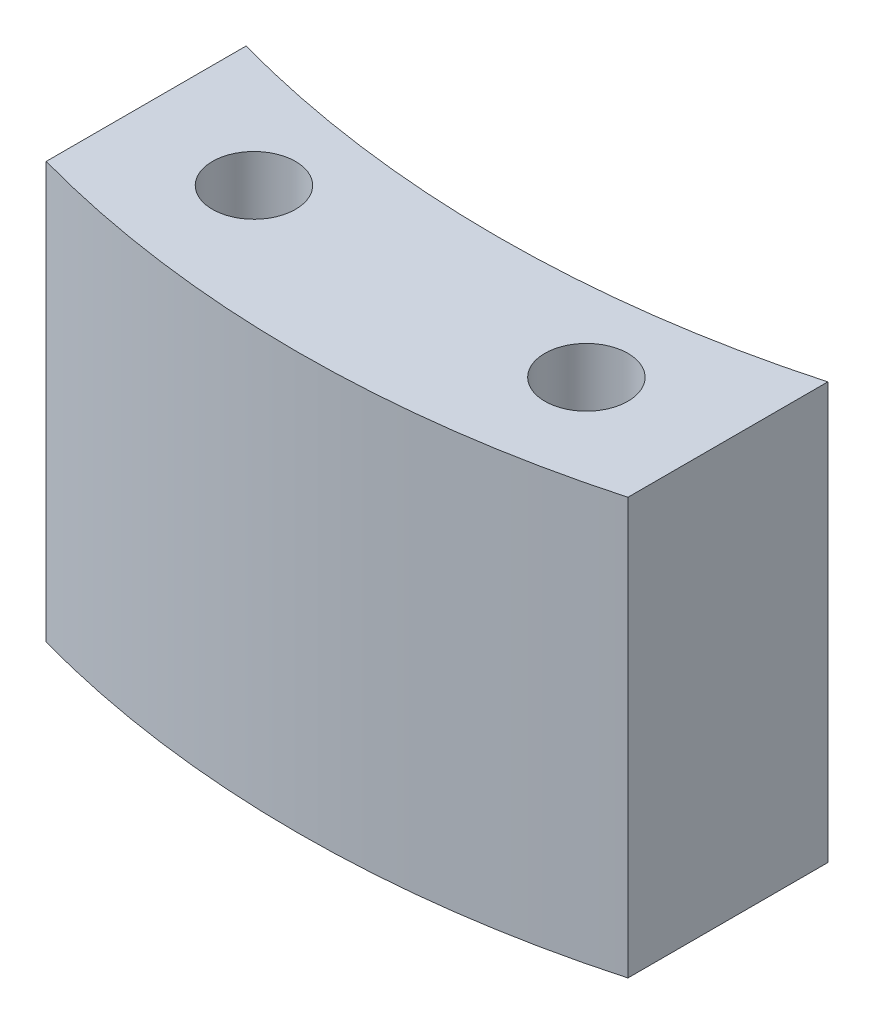
ISO-10303-21;
HEADER;
FILE_DESCRIPTION(('STEP AP214'),'2;1');
FILE_NAME('part.step','',(''),(''),'','','');
FILE_SCHEMA(('AUTOMOTIVE_DESIGN { 1 0 10303 214 1 1 1 1 }'));
ENDSEC;
DATA;
#1=APPLICATION_CONTEXT('core data for automotive mechanical design processes');
#2=APPLICATION_PROTOCOL_DEFINITION('international standard','automotive_design',2000,#1);
#3=PRODUCT_CONTEXT('',#1,'mechanical');
#4=PRODUCT('Part','Part','',(#3));
#5=PRODUCT_RELATED_PRODUCT_CATEGORY('part','',(#4));
#6=PRODUCT_DEFINITION_FORMATION('','',#4);
#7=PRODUCT_DEFINITION_CONTEXT('part definition',#1,'design');
#8=PRODUCT_DEFINITION('design','',#6,#7);
#9=PRODUCT_DEFINITION_SHAPE('','',#8);
#10=(LENGTH_UNIT() NAMED_UNIT(*) SI_UNIT(.MILLI.,.METRE.));
#11=(NAMED_UNIT(*) PLANE_ANGLE_UNIT() SI_UNIT($,.RADIAN.));
#12=(NAMED_UNIT(*) SI_UNIT($,.STERADIAN.) SOLID_ANGLE_UNIT());
#13=UNCERTAINTY_MEASURE_WITH_UNIT(LENGTH_MEASURE(1.E-05),#10,'distance_accuracy_value','');
#14=(GEOMETRIC_REPRESENTATION_CONTEXT(3) GLOBAL_UNCERTAINTY_ASSIGNED_CONTEXT((#13)) GLOBAL_UNIT_ASSIGNED_CONTEXT((#10,
#11,#12)) REPRESENTATION_CONTEXT('',''));
#15=CARTESIAN_POINT('',(0.,0.,0.));
#16=DIRECTION('',(0.,0.,1.));
#17=DIRECTION('',(1.,0.,0.));
#18=AXIS2_PLACEMENT_3D('',#15,#16,#17);
#19=CARTESIAN_POINT('',(0.,10.3886,0.));
#20=DIRECTION('',(0.,1.,0.));
#21=DIRECTION('',(0.,0.,1.));
#22=AXIS2_PLACEMENT_3D('',#19,#20,#21);
#23=PLANE('',#22);
#24=DIRECTION('',(0.745439659060937,0.,0.666573112793423));
#25=VECTOR('',#24,1.);
#26=CARTESIAN_POINT('',(5.58210296924748,10.3886,-6.24255742449733));
#27=LINE('',#26,#25);
#28=CARTESIAN_POINT('',(22.225,10.3886,8.63954274933077));
#29=VERTEX_POINT('',#28);
#30=CARTESIAN_POINT('',(5.58210296924748,10.3886,-6.24255742449733));
#31=VERTEX_POINT('',#30);
#32=EDGE_CURVE('E92',#29,#31,#27,.F.);
#33=ORIENTED_EDGE('',*,*,#32,.T.);
#34=CARTESIAN_POINT('',(0.,10.3886,0.));
#35=DIRECTION('',(0.,-1.,0.));
#36=DIRECTION('',(0.,0.,-1.));
#37=AXIS2_PLACEMENT_3D('',#34,#35,#36);
#38=CIRCLE('',#37,8.37432963033032);
#39=CARTESIAN_POINT('',(-5.58210296924748,10.3886,-6.24255742449734));
#40=VERTEX_POINT('',#39);
#41=EDGE_CURVE('E78',#40,#31,#38,.T.);
#42=ORIENTED_EDGE('',*,*,#41,.F.);
#43=DIRECTION('',(-0.745439659060937,0.,0.666573112793423));
#44=VECTOR('',#43,1.);
#45=CARTESIAN_POINT('',(-5.58210296924748,10.3886,-6.24255742449733));
#46=LINE('',#45,#44);
#47=CARTESIAN_POINT('',(-22.225,10.3886,8.63954274933077));
#48=VERTEX_POINT('',#47);
#49=EDGE_CURVE('E100',#48,#40,#46,.F.);
#50=ORIENTED_EDGE('',*,*,#49,.F.);
#51=CARTESIAN_POINT('',(0.,10.3886,-71.8463443264393));
#52=DIRECTION('',(0.,1.,0.));
#53=DIRECTION('',(0.,0.,1.));
#54=AXIS2_PLACEMENT_3D('',#51,#52,#53);
#55=CIRCLE('',#54,83.4980756866505);
#56=EDGE_CURVE('E95',#48,#29,#55,.T.);
#57=ORIENTED_EDGE('',*,*,#56,.T.);
#58=EDGE_LOOP('',(#33,#42,#50,#57));
#59=FACE_BOUND('',#58,.T.);
#60=CARTESIAN_POINT('',(0.,10.3886,0.));
#61=DIRECTION('',(0.,1.,0.));
#62=DIRECTION('',(0.,0.,1.));
#63=AXIS2_PLACEMENT_3D('',#60,#61,#62);
#64=CIRCLE('',#63,4.7498);
#65=CARTESIAN_POINT('',(0.,10.3886,4.7498));
#66=VERTEX_POINT('',#65);
#67=EDGE_CURVE('E19',#66,#66,#64,.F.);
#68=ORIENTED_EDGE('',*,*,#67,.T.);
#69=EDGE_LOOP('',(#68));
#70=FACE_BOUND('',#69,.T.);
#71=ADVANCED_FACE('F16',(#59,#70),#23,.T.);
#72=CARTESIAN_POINT('',(0.,0.,0.));
#73=DIRECTION('',(0.,1.,0.));
#74=DIRECTION('',(0.,0.,1.));
#75=AXIS2_PLACEMENT_3D('',#72,#73,#74);
#76=CYLINDRICAL_SURFACE('',#75,4.7498);
#77=CARTESIAN_POINT('',(0.,0.,0.));
#78=DIRECTION('',(0.,1.,0.));
#79=DIRECTION('',(0.,0.,1.));
#80=AXIS2_PLACEMENT_3D('',#77,#78,#79);
#81=CIRCLE('',#80,4.7498);
#82=CARTESIAN_POINT('',(0.,0.,4.7498));
#83=VERTEX_POINT('',#82);
#84=EDGE_CURVE('E142',#83,#83,#81,.F.);
#85=ORIENTED_EDGE('',*,*,#84,.T.);
#86=EDGE_LOOP('',(#85));
#87=FACE_BOUND('',#86,.T.);
#88=ORIENTED_EDGE('',*,*,#67,.F.);
#89=EDGE_LOOP('',(#88));
#90=FACE_BOUND('',#89,.T.);
#91=ADVANCED_FACE('F261',(#87,#90),#76,.F.);
#92=CARTESIAN_POINT('',(0.,31.8135,0.));
#93=DIRECTION('',(0.,-1.,0.));
#94=DIRECTION('',(0.,0.,-1.));
#95=AXIS2_PLACEMENT_3D('',#92,#93,#94);
#96=CYLINDRICAL_SURFACE('',#95,8.37432963033032);
#97=CARTESIAN_POINT('',(0.,0.,0.));
#98=DIRECTION('',(0.,-1.,0.));
#99=DIRECTION('',(0.,0.,-1.));
#100=AXIS2_PLACEMENT_3D('',#97,#98,#99);
#101=CIRCLE('',#100,8.37432963033032);
#102=CARTESIAN_POINT('',(5.58210296924748,0.,-6.24255742449734));
#103=VERTEX_POINT('',#102);
#104=CARTESIAN_POINT('',(-5.58210296924748,0.,-6.24255742449734));
#105=VERTEX_POINT('',#104);
#106=EDGE_CURVE('E139',#103,#105,#101,.F.);
#107=ORIENTED_EDGE('',*,*,#106,.T.);
#108=DIRECTION('',(0.,1.,0.));
#109=VECTOR('',#108,1.);
#110=CARTESIAN_POINT('',(-5.58210296924748,31.8135,-6.24255742449734));
#111=LINE('',#110,#109);
#112=EDGE_CURVE('E88',#40,#105,#111,.F.);
#113=ORIENTED_EDGE('',*,*,#112,.F.);
#114=ORIENTED_EDGE('',*,*,#41,.T.);
#115=DIRECTION('',(0.,1.,0.));
#116=VECTOR('',#115,1.);
#117=CARTESIAN_POINT('',(5.58210296924748,31.8135,-6.24255742449733));
#118=LINE('',#117,#116);
#119=EDGE_CURVE('E85',#31,#103,#118,.F.);
#120=ORIENTED_EDGE('',*,*,#119,.T.);
#121=EDGE_LOOP('',(#107,#113,#114,#120));
#122=FACE_BOUND('',#121,.T.);
#123=ADVANCED_FACE('F83',(#122),#96,.T.);
#124=CARTESIAN_POINT('',(5.58210296924748,31.8135,-6.24255742449733));
#125=DIRECTION('',(-0.666573112793423,0.,0.745439659060937));
#126=DIRECTION('',(0.745439659060937,0.,0.666573112793423));
#127=AXIS2_PLACEMENT_3D('',#124,#125,#126);
#128=PLANE('',#127);
#129=DIRECTION('',(0.,1.,0.));
#130=VECTOR('',#129,1.);
#131=CARTESIAN_POINT('',(22.225,31.8135,8.63954274933076));
#132=LINE('',#131,#130);
#133=CARTESIAN_POINT('',(22.225,0.,8.63954274933076));
#134=VERTEX_POINT('',#133);
#135=EDGE_CURVE('E164',#134,#29,#132,.T.);
#136=ORIENTED_EDGE('',*,*,#135,.F.);
#137=DIRECTION('',(-0.745439659060937,0.,-0.666573112793423));
#138=VECTOR('',#137,1.);
#139=CARTESIAN_POINT('',(22.225,0.,8.63954274933076));
#140=LINE('',#139,#138);
#141=EDGE_CURVE('E104',#134,#103,#140,.T.);
#142=ORIENTED_EDGE('',*,*,#141,.T.);
#143=ORIENTED_EDGE('',*,*,#119,.F.);
#144=ORIENTED_EDGE('',*,*,#32,.F.);
#145=EDGE_LOOP('',(#136,#142,#143,#144));
#146=FACE_BOUND('',#145,.T.);
#147=ADVANCED_FACE('F102',(#146),#128,.F.);
#148=CARTESIAN_POINT('',(-12.7,31.8135,17.5618113891196));
#149=DIRECTION('',(0.,-1.,0.));
#150=DIRECTION('',(0.,0.,-1.));
#151=AXIS2_PLACEMENT_3D('',#148,#149,#150);
#152=CYLINDRICAL_SURFACE('',#151,3.175);
#153=CARTESIAN_POINT('',(-12.7,31.8135,17.5618113891196));
#154=DIRECTION('',(0.,-1.,0.));
#155=DIRECTION('',(0.,0.,-1.));
#156=AXIS2_PLACEMENT_3D('',#153,#154,#155);
#157=CIRCLE('',#156,3.175);
#158=CARTESIAN_POINT('',(-12.7,31.8135,14.3868113891196));
#159=VERTEX_POINT('',#158);
#160=EDGE_CURVE('E123',#159,#159,#157,.T.);
#161=ORIENTED_EDGE('',*,*,#160,.F.);
#162=EDGE_LOOP('',(#161));
#163=FACE_BOUND('',#162,.T.);
#164=CARTESIAN_POINT('',(-12.7,0.,17.5618113891196));
#165=DIRECTION('',(0.,-1.,0.));
#166=DIRECTION('',(0.,0.,-1.));
#167=AXIS2_PLACEMENT_3D('',#164,#165,#166);
#168=CIRCLE('',#167,3.175);
#169=CARTESIAN_POINT('',(-12.7,0.,14.3868113891196));
#170=VERTEX_POINT('',#169);
#171=EDGE_CURVE('E134',#170,#170,#168,.T.);
#172=ORIENTED_EDGE('',*,*,#171,.T.);
#173=EDGE_LOOP('',(#172));
#174=FACE_BOUND('',#173,.T.);
#175=ADVANCED_FACE('F228',(#163,#174),#152,.F.);
#176=CARTESIAN_POINT('',(12.7,31.8135,17.5618113891196));
#177=DIRECTION('',(0.,-1.,0.));
#178=DIRECTION('',(0.,0.,-1.));
#179=AXIS2_PLACEMENT_3D('',#176,#177,#178);
#180=CYLINDRICAL_SURFACE('',#179,3.175);
#181=CARTESIAN_POINT('',(12.7,0.,17.5618113891196));
#182=DIRECTION('',(0.,-1.,0.));
#183=DIRECTION('',(0.,0.,-1.));
#184=AXIS2_PLACEMENT_3D('',#181,#182,#183);
#185=CIRCLE('',#184,3.175);
#186=CARTESIAN_POINT('',(12.7,0.,14.3868113891196));
#187=VERTEX_POINT('',#186);
#188=EDGE_CURVE('E130',#187,#187,#185,.T.);
#189=ORIENTED_EDGE('',*,*,#188,.T.);
#190=EDGE_LOOP('',(#189));
#191=FACE_BOUND('',#190,.T.);
#192=CARTESIAN_POINT('',(12.7,31.8135,17.5618113891196));
#193=DIRECTION('',(0.,-1.,0.));
#194=DIRECTION('',(0.,0.,-1.));
#195=AXIS2_PLACEMENT_3D('',#192,#193,#194);
#196=CIRCLE('',#195,3.175);
#197=CARTESIAN_POINT('',(12.7,31.8135,14.3868113891196));
#198=VERTEX_POINT('',#197);
#199=EDGE_CURVE('E118',#198,#198,#196,.T.);
#200=ORIENTED_EDGE('',*,*,#199,.F.);
#201=EDGE_LOOP('',(#200));
#202=FACE_BOUND('',#201,.T.);
#203=ADVANCED_FACE('F218',(#191,#202),#180,.F.);
#204=CARTESIAN_POINT('',(-5.58210296924748,31.8135,-6.24255742449733));
#205=DIRECTION('',(-0.666573112793423,0.,-0.745439659060937));
#206=DIRECTION('',(-0.745439659060937,0.,0.666573112793423));
#207=AXIS2_PLACEMENT_3D('',#204,#205,#206);
#208=PLANE('',#207);
#209=ORIENTED_EDGE('',*,*,#112,.T.);
#210=DIRECTION('',(-0.745439659060937,0.,0.666573112793423));
#211=VECTOR('',#210,1.);
#212=CARTESIAN_POINT('',(-5.58210296924748,0.,-6.24255742449734));
#213=LINE('',#212,#211);
#214=CARTESIAN_POINT('',(-22.225,0.,8.63954274933076));
#215=VERTEX_POINT('',#214);
#216=EDGE_CURVE('E138',#105,#215,#213,.T.);
#217=ORIENTED_EDGE('',*,*,#216,.T.);
#218=DIRECTION('',(0.,1.,0.));
#219=VECTOR('',#218,1.);
#220=CARTESIAN_POINT('',(-22.225,31.8135,8.63954274933076));
#221=LINE('',#220,#219);
#222=EDGE_CURVE('E122',#215,#48,#221,.T.);
#223=ORIENTED_EDGE('',*,*,#222,.T.);
#224=ORIENTED_EDGE('',*,*,#49,.T.);
#225=EDGE_LOOP('',(#209,#217,#223,#224));
#226=FACE_BOUND('',#225,.T.);
#227=ADVANCED_FACE('F216',(#226),#208,.T.);
#228=CARTESIAN_POINT('',(0.,10.3886,-71.8463443264393));
#229=DIRECTION('',(0.,1.,0.));
#230=DIRECTION('',(0.,0.,1.));
#231=AXIS2_PLACEMENT_3D('',#228,#229,#230);
#232=CYLINDRICAL_SURFACE('',#231,83.4980756866505);
#233=ORIENTED_EDGE('',*,*,#56,.F.);
#234=DIRECTION('',(0.,1.,0.));
#235=VECTOR('',#234,1.);
#236=CARTESIAN_POINT('',(-22.225,31.8135,8.63954274933077));
#237=LINE('',#236,#235);
#238=CARTESIAN_POINT('',(-22.225,31.8135,8.63954274933077));
#239=VERTEX_POINT('',#238);
#240=EDGE_CURVE('E159',#48,#239,#237,.T.);
#241=ORIENTED_EDGE('',*,*,#240,.T.);
#242=CARTESIAN_POINT('',(0.,31.8135,-71.8463443264393));
#243=DIRECTION('',(0.,1.,0.));
#244=DIRECTION('',(0.,0.,1.));
#245=AXIS2_PLACEMENT_3D('',#242,#243,#244);
#246=CIRCLE('',#245,83.4980756866505);
#247=CARTESIAN_POINT('',(22.225,31.8135,8.63954274933077));
#248=VERTEX_POINT('',#247);
#249=EDGE_CURVE('E126',#248,#239,#246,.F.);
#250=ORIENTED_EDGE('',*,*,#249,.F.);
#251=DIRECTION('',(0.,1.,0.));
#252=VECTOR('',#251,1.);
#253=CARTESIAN_POINT('',(22.225,31.8135,8.63954274933077));
#254=LINE('',#253,#252);
#255=EDGE_CURVE('E161',#29,#248,#254,.T.);
#256=ORIENTED_EDGE('',*,*,#255,.F.);
#257=EDGE_LOOP('',(#233,#241,#250,#256));
#258=FACE_BOUND('',#257,.T.);
#259=ADVANCED_FACE('F198',(#258),#232,.F.);
#260=CARTESIAN_POINT('',(0.,0.,0.));
#261=DIRECTION('',(0.,1.,0.));
#262=DIRECTION('',(0.,0.,1.));
#263=AXIS2_PLACEMENT_3D('',#260,#261,#262);
#264=PLANE('',#263);
#265=ORIENTED_EDGE('',*,*,#188,.F.);
#266=EDGE_LOOP('',(#265));
#267=FACE_BOUND('',#266,.T.);
#268=ORIENTED_EDGE('',*,*,#171,.F.);
#269=EDGE_LOOP('',(#268));
#270=FACE_BOUND('',#269,.T.);
#271=ORIENTED_EDGE('',*,*,#216,.F.);
#272=ORIENTED_EDGE('',*,*,#106,.F.);
#273=ORIENTED_EDGE('',*,*,#141,.F.);
#274=DIRECTION('',(0.,0.,-1.));
#275=VECTOR('',#274,1.);
#276=CARTESIAN_POINT('',(22.225,0.,0.));
#277=LINE('',#276,#275);
#278=CARTESIAN_POINT('',(22.225,0.,23.9118113891196));
#279=VERTEX_POINT('',#278);
#280=EDGE_CURVE('E133',#279,#134,#277,.T.);
#281=ORIENTED_EDGE('',*,*,#280,.F.);
#282=CARTESIAN_POINT('',(0.,0.,-56.574075686651));
#283=DIRECTION('',(0.,-1.,0.));
#284=DIRECTION('',(0.,0.,-1.));
#285=AXIS2_PLACEMENT_3D('',#282,#283,#284);
#286=CIRCLE('',#285,83.498075686651);
#287=CARTESIAN_POINT('',(-22.225,0.,23.9118113891196));
#288=VERTEX_POINT('',#287);
#289=EDGE_CURVE('E114',#288,#279,#286,.F.);
#290=ORIENTED_EDGE('',*,*,#289,.F.);
#291=DIRECTION('',(0.,0.,-1.));
#292=VECTOR('',#291,1.);
#293=CARTESIAN_POINT('',(-22.225,0.,0.));
#294=LINE('',#293,#292);
#295=EDGE_CURVE('E117',#288,#215,#294,.T.);
#296=ORIENTED_EDGE('',*,*,#295,.T.);
#297=EDGE_LOOP('',(#271,#272,#273,#281,#290,#296));
#298=FACE_BOUND('',#297,.T.);
#299=ORIENTED_EDGE('',*,*,#84,.F.);
#300=EDGE_LOOP('',(#299));
#301=FACE_BOUND('',#300,.T.);
#302=ADVANCED_FACE('F212',(#267,#270,#298,#301),#264,.F.);
#303=CARTESIAN_POINT('',(22.225,31.8135,0.));
#304=DIRECTION('',(1.,0.,0.));
#305=DIRECTION('',(0.,0.,-1.));
#306=AXIS2_PLACEMENT_3D('',#303,#304,#305);
#307=PLANE('',#306);
#308=DIRECTION('',(0.,0.,1.));
#309=VECTOR('',#308,1.);
#310=CARTESIAN_POINT('',(22.225,31.8135,0.));
#311=LINE('',#310,#309);
#312=CARTESIAN_POINT('',(22.225,31.8135,23.9118113891196));
#313=VERTEX_POINT('',#312);
#314=EDGE_CURVE('E129',#313,#248,#311,.F.);
#315=ORIENTED_EDGE('',*,*,#314,.F.);
#316=DIRECTION('',(0.,-1.,0.));
#317=VECTOR('',#316,1.);
#318=CARTESIAN_POINT('',(22.225,31.8135,23.9118113891196));
#319=LINE('',#318,#317);
#320=EDGE_CURVE('E113',#279,#313,#319,.F.);
#321=ORIENTED_EDGE('',*,*,#320,.F.);
#322=ORIENTED_EDGE('',*,*,#280,.T.);
#323=ORIENTED_EDGE('',*,*,#135,.T.);
#324=ORIENTED_EDGE('',*,*,#255,.T.);
#325=EDGE_LOOP('',(#315,#321,#322,#323,#324));
#326=FACE_BOUND('',#325,.T.);
#327=ADVANCED_FACE('F210',(#326),#307,.T.);
#328=CARTESIAN_POINT('',(0.,31.8135,0.));
#329=DIRECTION('',(0.,1.,0.));
#330=DIRECTION('',(0.,0.,1.));
#331=AXIS2_PLACEMENT_3D('',#328,#329,#330);
#332=PLANE('',#331);
#333=ORIENTED_EDGE('',*,*,#199,.T.);
#334=EDGE_LOOP('',(#333));
#335=FACE_BOUND('',#334,.T.);
#336=ORIENTED_EDGE('',*,*,#160,.T.);
#337=EDGE_LOOP('',(#336));
#338=FACE_BOUND('',#337,.T.);
#339=ORIENTED_EDGE('',*,*,#314,.T.);
#340=ORIENTED_EDGE('',*,*,#249,.T.);
#341=DIRECTION('',(0.,0.,-1.));
#342=VECTOR('',#341,1.);
#343=CARTESIAN_POINT('',(-22.225,31.8135,0.));
#344=LINE('',#343,#342);
#345=CARTESIAN_POINT('',(-22.225,31.8135,23.9118113891196));
#346=VERTEX_POINT('',#345);
#347=EDGE_CURVE('E35',#239,#346,#344,.F.);
#348=ORIENTED_EDGE('',*,*,#347,.T.);
#349=CARTESIAN_POINT('',(0.,31.8135,-56.574075686651));
#350=DIRECTION('',(0.,-1.,0.));
#351=DIRECTION('',(0.,0.,-1.));
#352=AXIS2_PLACEMENT_3D('',#349,#350,#351);
#353=CIRCLE('',#352,83.498075686651);
#354=EDGE_CURVE('E26',#313,#346,#353,.T.);
#355=ORIENTED_EDGE('',*,*,#354,.F.);
#356=EDGE_LOOP('',(#339,#340,#348,#355));
#357=FACE_BOUND('',#356,.T.);
#358=ADVANCED_FACE('F206',(#335,#338,#357),#332,.T.);
#359=CARTESIAN_POINT('',(-22.225,31.8135,0.));
#360=DIRECTION('',(1.,0.,0.));
#361=DIRECTION('',(0.,0.,-1.));
#362=AXIS2_PLACEMENT_3D('',#359,#360,#361);
#363=PLANE('',#362);
#364=DIRECTION('',(0.,-1.,0.));
#365=VECTOR('',#364,1.);
#366=CARTESIAN_POINT('',(-22.225,31.8135,23.9118113891196));
#367=LINE('',#366,#365);
#368=EDGE_CURVE('E11',#346,#288,#367,.T.);
#369=ORIENTED_EDGE('',*,*,#368,.F.);
#370=ORIENTED_EDGE('',*,*,#347,.F.);
#371=ORIENTED_EDGE('',*,*,#240,.F.);
#372=ORIENTED_EDGE('',*,*,#222,.F.);
#373=ORIENTED_EDGE('',*,*,#295,.F.);
#374=EDGE_LOOP('',(#369,#370,#371,#372,#373));
#375=FACE_BOUND('',#374,.T.);
#376=ADVANCED_FACE('F201',(#375),#363,.F.);
#377=CARTESIAN_POINT('',(0.,31.8135,-56.574075686651));
#378=DIRECTION('',(0.,-1.,0.));
#379=DIRECTION('',(0.,0.,-1.));
#380=AXIS2_PLACEMENT_3D('',#377,#378,#379);
#381=CYLINDRICAL_SURFACE('',#380,83.498075686651);
#382=ORIENTED_EDGE('',*,*,#354,.T.);
#383=ORIENTED_EDGE('',*,*,#368,.T.);
#384=ORIENTED_EDGE('',*,*,#289,.T.);
#385=ORIENTED_EDGE('',*,*,#320,.T.);
#386=EDGE_LOOP('',(#382,#383,#384,#385));
#387=FACE_BOUND('',#386,.T.);
#388=ADVANCED_FACE('F205',(#387),#381,.T.);
#389=CLOSED_SHELL('',(#71,#91,#123,#147,#175,#203,#227,#259,#302,#327,#358,#376,#388));
#390=MANIFOLD_SOLID_BREP('B1',#389);
#391=ADVANCED_BREP_SHAPE_REPRESENTATION('',(#18,#390),#14);
#392=SHAPE_DEFINITION_REPRESENTATION(#9,#391);
ENDSEC;
END-ISO-10303-21;
